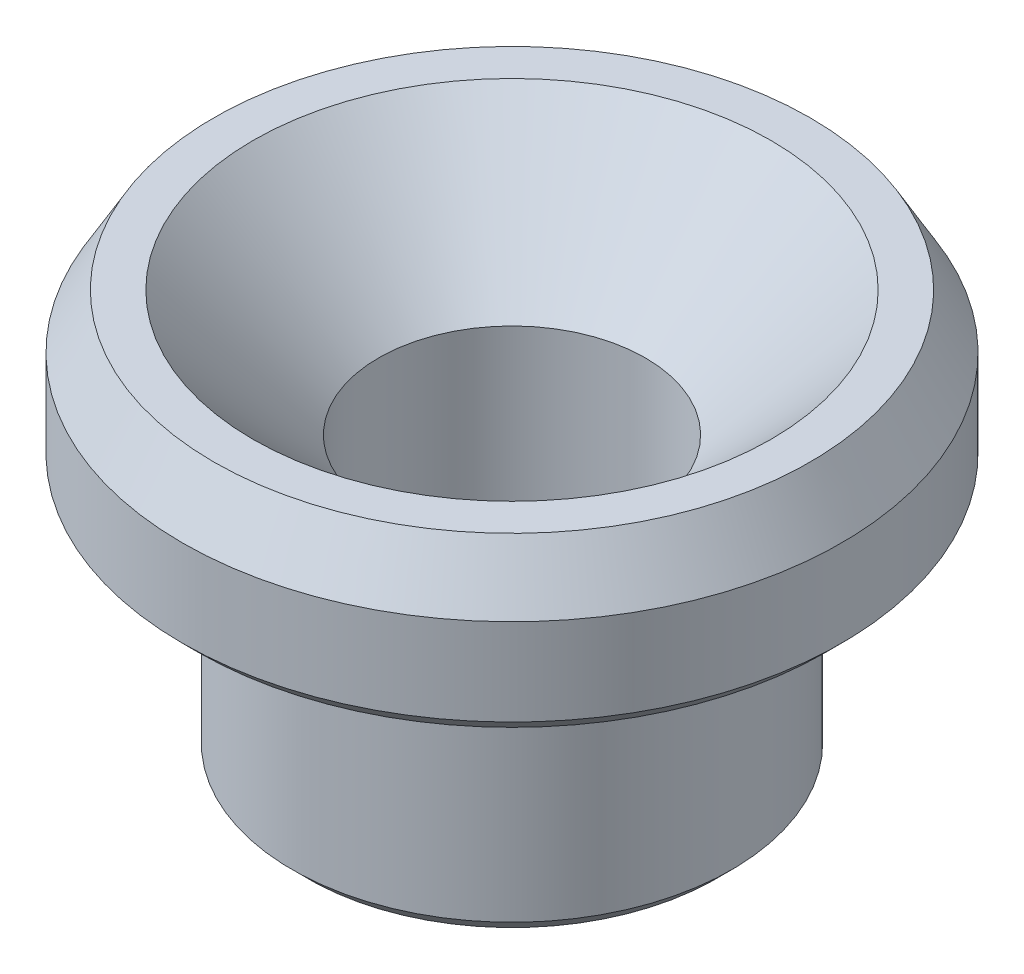
ISO-10303-21;
HEADER;
FILE_DESCRIPTION(('STEP AP214'),'2;1');
FILE_NAME('part.step','',(''),(''),'','','');
FILE_SCHEMA(('AUTOMOTIVE_DESIGN { 1 0 10303 214 1 1 1 1 }'));
ENDSEC;
DATA;
#1=APPLICATION_CONTEXT('core data for automotive mechanical design processes');
#2=APPLICATION_PROTOCOL_DEFINITION('international standard','automotive_design',2000,#1);
#3=PRODUCT_CONTEXT('',#1,'mechanical');
#4=PRODUCT('Part','Part','',(#3));
#5=PRODUCT_RELATED_PRODUCT_CATEGORY('part','',(#4));
#6=PRODUCT_DEFINITION_FORMATION('','',#4);
#7=PRODUCT_DEFINITION_CONTEXT('part definition',#1,'design');
#8=PRODUCT_DEFINITION('design','',#6,#7);
#9=PRODUCT_DEFINITION_SHAPE('','',#8);
#10=(LENGTH_UNIT() NAMED_UNIT(*) SI_UNIT(.MILLI.,.METRE.));
#11=(NAMED_UNIT(*) PLANE_ANGLE_UNIT() SI_UNIT($,.RADIAN.));
#12=(NAMED_UNIT(*) SI_UNIT($,.STERADIAN.) SOLID_ANGLE_UNIT());
#13=UNCERTAINTY_MEASURE_WITH_UNIT(LENGTH_MEASURE(1.E-05),#10,'distance_accuracy_value','');
#14=(GEOMETRIC_REPRESENTATION_CONTEXT(3) GLOBAL_UNCERTAINTY_ASSIGNED_CONTEXT((#13)) GLOBAL_UNIT_ASSIGNED_CONTEXT((#10,
#11,#12)) REPRESENTATION_CONTEXT('',''));
#15=CARTESIAN_POINT('',(0.,0.,0.));
#16=DIRECTION('',(0.,0.,1.));
#17=DIRECTION('',(1.,0.,0.));
#18=AXIS2_PLACEMENT_3D('',#15,#16,#17);
#19=CARTESIAN_POINT('',(7.,0.,0.));
#20=DIRECTION('',(0.,-1.,0.));
#21=DIRECTION('',(0.,0.,-1.));
#22=AXIS2_PLACEMENT_3D('',#19,#20,#21);
#23=PLANE('',#22);
#24=CARTESIAN_POINT('',(0.,0.,0.));
#25=DIRECTION('',(0.,-1.,0.));
#26=DIRECTION('',(0.,0.,-1.));
#27=AXIS2_PLACEMENT_3D('',#24,#25,#26);
#28=CIRCLE('',#27,6.49999999999999);
#29=CARTESIAN_POINT('',(0.,0.,-6.49999999999999));
#30=VERTEX_POINT('',#29);
#31=EDGE_CURVE('E49',#30,#30,#28,.T.);
#32=ORIENTED_EDGE('',*,*,#31,.T.);
#33=EDGE_LOOP('',(#32));
#34=FACE_BOUND('',#33,.T.);
#35=CARTESIAN_POINT('',(0.,0.,0.));
#36=DIRECTION('',(0.,-1.,0.));
#37=DIRECTION('',(0.,0.,-1.));
#38=AXIS2_PLACEMENT_3D('',#35,#36,#37);
#39=CIRCLE('',#38,4.25);
#40=CARTESIAN_POINT('',(0.,0.,-4.25));
#41=VERTEX_POINT('',#40);
#42=EDGE_CURVE('E68',#41,#41,#39,.T.);
#43=ORIENTED_EDGE('',*,*,#42,.F.);
#44=EDGE_LOOP('',(#43));
#45=FACE_BOUND('',#44,.T.);
#46=ADVANCED_FACE('F41',(#34,#45),#23,.T.);
#47=CARTESIAN_POINT('',(0.,0.,0.));
#48=DIRECTION('',(0.,-1.,0.));
#49=DIRECTION('',(0.,0.,-1.));
#50=AXIS2_PLACEMENT_3D('',#47,#48,#49);
#51=CYLINDRICAL_SURFACE('',#50,4.25);
#52=ORIENTED_EDGE('',*,*,#42,.T.);
#53=EDGE_LOOP('',(#52));
#54=FACE_BOUND('',#53,.T.);
#55=CARTESIAN_POINT('',(0.,9.,0.));
#56=DIRECTION('',(0.,-1.,0.));
#57=DIRECTION('',(0.,0.,-1.));
#58=AXIS2_PLACEMENT_3D('',#55,#56,#57);
#59=CIRCLE('',#58,4.25);
#60=CARTESIAN_POINT('',(0.,9.,-4.25));
#61=VERTEX_POINT('',#60);
#62=EDGE_CURVE('E71',#61,#61,#59,.T.);
#63=ORIENTED_EDGE('',*,*,#62,.F.);
#64=EDGE_LOOP('',(#63));
#65=FACE_BOUND('',#64,.T.);
#66=ADVANCED_FACE('F98',(#54,#65),#51,.F.);
#67=CARTESIAN_POINT('',(0.,13.,0.));
#68=DIRECTION('',(0.,1.,0.));
#69=DIRECTION('',(0.,0.,1.));
#70=AXIS2_PLACEMENT_3D('',#67,#68,#69);
#71=CONICAL_SURFACE('',#70,8.25000000000017,0.785398163397469);
#72=ORIENTED_EDGE('',*,*,#62,.T.);
#73=EDGE_LOOP('',(#72));
#74=FACE_BOUND('',#73,.T.);
#75=CARTESIAN_POINT('',(0.,13.,0.));
#76=DIRECTION('',(0.,-1.,0.));
#77=DIRECTION('',(0.,0.,-1.));
#78=AXIS2_PLACEMENT_3D('',#75,#76,#77);
#79=CIRCLE('',#78,8.25000000000017);
#80=CARTESIAN_POINT('',(0.,13.,-8.25000000000017));
#81=VERTEX_POINT('',#80);
#82=EDGE_CURVE('E74',#81,#81,#79,.T.);
#83=ORIENTED_EDGE('',*,*,#82,.F.);
#84=EDGE_LOOP('',(#83));
#85=FACE_BOUND('',#84,.T.);
#86=ADVANCED_FACE('F104',(#74,#85),#71,.F.);
#87=CARTESIAN_POINT('',(8.25000000000017,13.,0.));
#88=DIRECTION('',(0.,1.,0.));
#89=DIRECTION('',(0.,0.,1.));
#90=AXIS2_PLACEMENT_3D('',#87,#88,#89);
#91=PLANE('',#90);
#92=CARTESIAN_POINT('',(0.,13.,0.));
#93=DIRECTION('',(0.,1.,0.));
#94=DIRECTION('',(0.,0.,1.));
#95=AXIS2_PLACEMENT_3D('',#92,#93,#94);
#96=CIRCLE('',#95,9.49999999999999);
#97=CARTESIAN_POINT('',(0.,13.,9.49999999999999));
#98=VERTEX_POINT('',#97);
#99=EDGE_CURVE('E62',#98,#98,#96,.T.);
#100=ORIENTED_EDGE('',*,*,#99,.T.);
#101=EDGE_LOOP('',(#100));
#102=FACE_BOUND('',#101,.T.);
#103=ORIENTED_EDGE('',*,*,#82,.T.);
#104=EDGE_LOOP('',(#103));
#105=FACE_BOUND('',#104,.T.);
#106=ADVANCED_FACE('F94',(#102,#105),#91,.T.);
#107=CARTESIAN_POINT('',(0.,0.,0.));
#108=DIRECTION('',(0.,-1.,0.));
#109=DIRECTION('',(0.,0.,-1.));
#110=AXIS2_PLACEMENT_3D('',#107,#108,#109);
#111=CYLINDRICAL_SURFACE('',#110,10.5);
#112=CARTESIAN_POINT('',(0.,8.50000000000001,0.));
#113=DIRECTION('',(0.,-1.,0.));
#114=DIRECTION('',(0.,0.,-1.));
#115=AXIS2_PLACEMENT_3D('',#112,#113,#114);
#116=CIRCLE('',#115,10.5);
#117=CARTESIAN_POINT('',(0.,8.50000000000001,-10.5));
#118=VERTEX_POINT('',#117);
#119=EDGE_CURVE('E53',#118,#118,#116,.F.);
#120=ORIENTED_EDGE('',*,*,#119,.T.);
#121=EDGE_LOOP('',(#120));
#122=FACE_BOUND('',#121,.T.);
#123=CARTESIAN_POINT('',(0.,11.2679491924311,0.));
#124=DIRECTION('',(0.,1.,0.));
#125=DIRECTION('',(0.,0.,1.));
#126=AXIS2_PLACEMENT_3D('',#123,#124,#125);
#127=CIRCLE('',#126,10.5);
#128=CARTESIAN_POINT('',(0.,11.2679491924311,10.5));
#129=VERTEX_POINT('',#128);
#130=EDGE_CURVE('E65',#129,#129,#127,.F.);
#131=ORIENTED_EDGE('',*,*,#130,.T.);
#132=EDGE_LOOP('',(#131));
#133=FACE_BOUND('',#132,.T.);
#134=ADVANCED_FACE('F85',(#122,#133),#111,.T.);
#135=CARTESIAN_POINT('',(10.5,8.,0.));
#136=DIRECTION('',(0.,-1.,0.));
#137=DIRECTION('',(0.,0.,-1.));
#138=AXIS2_PLACEMENT_3D('',#135,#136,#137);
#139=PLANE('',#138);
#140=CARTESIAN_POINT('',(0.,8.,0.));
#141=DIRECTION('',(0.,-1.,0.));
#142=DIRECTION('',(0.,0.,-1.));
#143=AXIS2_PLACEMENT_3D('',#140,#141,#142);
#144=CIRCLE('',#143,9.99999999999999);
#145=CARTESIAN_POINT('',(0.,8.,-9.99999999999999));
#146=VERTEX_POINT('',#145);
#147=EDGE_CURVE('E57',#146,#146,#144,.T.);
#148=ORIENTED_EDGE('',*,*,#147,.T.);
#149=EDGE_LOOP('',(#148));
#150=FACE_BOUND('',#149,.T.);
#151=CARTESIAN_POINT('',(0.,8.,0.));
#152=DIRECTION('',(0.,-1.,0.));
#153=DIRECTION('',(0.,0.,-1.));
#154=AXIS2_PLACEMENT_3D('',#151,#152,#153);
#155=CIRCLE('',#154,7.);
#156=CARTESIAN_POINT('',(0.,8.,-7.));
#157=VERTEX_POINT('',#156);
#158=EDGE_CURVE('E77',#157,#157,#155,.T.);
#159=ORIENTED_EDGE('',*,*,#158,.F.);
#160=EDGE_LOOP('',(#159));
#161=FACE_BOUND('',#160,.T.);
#162=ADVANCED_FACE('F83',(#150,#161),#139,.T.);
#163=CARTESIAN_POINT('',(0.,0.,0.));
#164=DIRECTION('',(0.,-1.,0.));
#165=DIRECTION('',(0.,0.,-1.));
#166=AXIS2_PLACEMENT_3D('',#163,#164,#165);
#167=CYLINDRICAL_SURFACE('',#166,7.);
#168=CARTESIAN_POINT('',(0.,0.500000000000008,0.));
#169=DIRECTION('',(0.,-1.,0.));
#170=DIRECTION('',(0.,0.,-1.));
#171=AXIS2_PLACEMENT_3D('',#168,#169,#170);
#172=CIRCLE('',#171,7.);
#173=CARTESIAN_POINT('',(0.,0.500000000000008,-7.));
#174=VERTEX_POINT('',#173);
#175=EDGE_CURVE('E10',#174,#174,#172,.F.);
#176=ORIENTED_EDGE('',*,*,#175,.T.);
#177=EDGE_LOOP('',(#176));
#178=FACE_BOUND('',#177,.T.);
#179=ORIENTED_EDGE('',*,*,#158,.T.);
#180=EDGE_LOOP('',(#179));
#181=FACE_BOUND('',#180,.T.);
#182=ADVANCED_FACE('F81',(#178,#181),#167,.T.);
#183=CARTESIAN_POINT('',(0.,11.2679491924311,0.));
#184=DIRECTION('',(0.,-1.,0.));
#185=DIRECTION('',(0.,0.,-1.));
#186=AXIS2_PLACEMENT_3D('',#183,#184,#185);
#187=CONICAL_SURFACE('',#186,10.5,0.5235987755983);
#188=ORIENTED_EDGE('',*,*,#99,.F.);
#189=EDGE_LOOP('',(#188));
#190=FACE_BOUND('',#189,.T.);
#191=ORIENTED_EDGE('',*,*,#130,.F.);
#192=EDGE_LOOP('',(#191));
#193=FACE_BOUND('',#192,.T.);
#194=ADVANCED_FACE('F92',(#190,#193),#187,.T.);
#195=CARTESIAN_POINT('',(0.,8.,0.));
#196=DIRECTION('',(0.,1.,0.));
#197=DIRECTION('',(0.,0.,1.));
#198=AXIS2_PLACEMENT_3D('',#195,#196,#197);
#199=CONICAL_SURFACE('',#198,9.99999999999999,0.785398163397448);
#200=ORIENTED_EDGE('',*,*,#119,.F.);
#201=EDGE_LOOP('',(#200));
#202=FACE_BOUND('',#201,.T.);
#203=ORIENTED_EDGE('',*,*,#147,.F.);
#204=EDGE_LOOP('',(#203));
#205=FACE_BOUND('',#204,.T.);
#206=ADVANCED_FACE('F114',(#202,#205),#199,.T.);
#207=CARTESIAN_POINT('',(0.,0.,0.));
#208=DIRECTION('',(0.,1.,0.));
#209=DIRECTION('',(0.,0.,1.));
#210=AXIS2_PLACEMENT_3D('',#207,#208,#209);
#211=CONICAL_SURFACE('',#210,6.49999999999999,0.785398163397453);
#212=ORIENTED_EDGE('',*,*,#175,.F.);
#213=EDGE_LOOP('',(#212));
#214=FACE_BOUND('',#213,.T.);
#215=ORIENTED_EDGE('',*,*,#31,.F.);
#216=EDGE_LOOP('',(#215));
#217=FACE_BOUND('',#216,.T.);
#218=ADVANCED_FACE('F44',(#214,#217),#211,.T.);
#219=CLOSED_SHELL('',(#46,#66,#86,#106,#134,#162,#182,#194,#206,#218));
#220=MANIFOLD_SOLID_BREP('B2',#219);
#221=ADVANCED_BREP_SHAPE_REPRESENTATION('',(#18,#220),#14);
#222=SHAPE_DEFINITION_REPRESENTATION(#9,#221);
ENDSEC;
END-ISO-10303-21;
